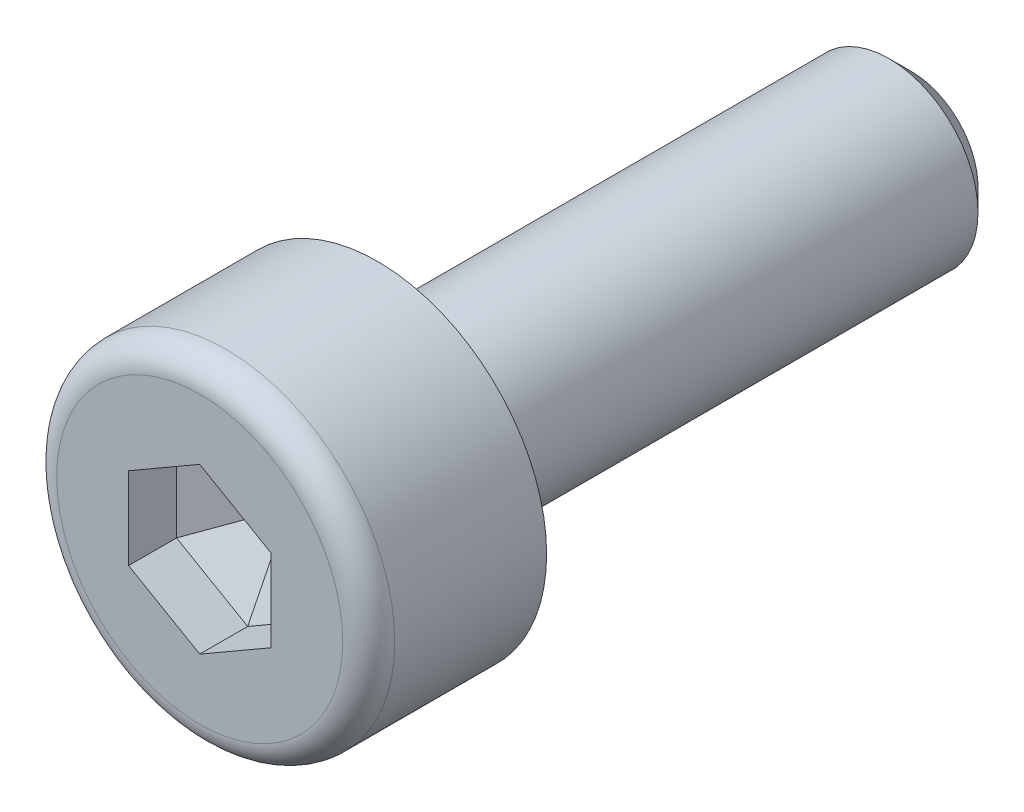
ISO-10303-21;
HEADER;
FILE_DESCRIPTION(('STEP AP214'),'2;1');
FILE_NAME('part.step','',(''),(''),'','','');
FILE_SCHEMA(('AUTOMOTIVE_DESIGN { 1 0 10303 214 1 1 1 1 }'));
ENDSEC;
DATA;
#1=APPLICATION_CONTEXT('core data for automotive mechanical design processes');
#2=APPLICATION_PROTOCOL_DEFINITION('international standard','automotive_design',2000,#1);
#3=PRODUCT_CONTEXT('',#1,'mechanical');
#4=PRODUCT('Part','Part','',(#3));
#5=PRODUCT_RELATED_PRODUCT_CATEGORY('part','',(#4));
#6=PRODUCT_DEFINITION_FORMATION('','',#4);
#7=PRODUCT_DEFINITION_CONTEXT('part definition',#1,'design');
#8=PRODUCT_DEFINITION('design','',#6,#7);
#9=PRODUCT_DEFINITION_SHAPE('','',#8);
#10=(LENGTH_UNIT() NAMED_UNIT(*) SI_UNIT(.MILLI.,.METRE.));
#11=(NAMED_UNIT(*) PLANE_ANGLE_UNIT() SI_UNIT($,.RADIAN.));
#12=(NAMED_UNIT(*) SI_UNIT($,.STERADIAN.) SOLID_ANGLE_UNIT());
#13=UNCERTAINTY_MEASURE_WITH_UNIT(LENGTH_MEASURE(1.E-05),#10,'distance_accuracy_value','');
#14=(GEOMETRIC_REPRESENTATION_CONTEXT(3) GLOBAL_UNCERTAINTY_ASSIGNED_CONTEXT((#13)) GLOBAL_UNIT_ASSIGNED_CONTEXT((#10,
#11,#12)) REPRESENTATION_CONTEXT('',''));
#15=CARTESIAN_POINT('',(0.,0.,0.));
#16=DIRECTION('',(0.,0.,1.));
#17=DIRECTION('',(1.,0.,0.));
#18=AXIS2_PLACEMENT_3D('',#15,#16,#17);
#19=CARTESIAN_POINT('',(0.,0.,0.));
#20=DIRECTION('',(0.,0.,1.));
#21=DIRECTION('',(1.,0.,0.));
#22=AXIS2_PLACEMENT_3D('',#19,#20,#21);
#23=PLANE('',#22);
#24=CARTESIAN_POINT('',(0.,0.,0.));
#25=DIRECTION('',(0.,0.,1.));
#26=DIRECTION('',(1.,0.,0.));
#27=AXIS2_PLACEMENT_3D('',#24,#25,#26);
#28=CIRCLE('',#27,1.1);
#29=CARTESIAN_POINT('',(1.1,0.,0.));
#30=VERTEX_POINT('',#29);
#31=EDGE_CURVE('E11',#30,#30,#28,.T.);
#32=ORIENTED_EDGE('',*,*,#31,.T.);
#33=EDGE_LOOP('',(#32));
#34=FACE_BOUND('',#33,.T.);
#35=CARTESIAN_POINT('',(0.,0.,0.));
#36=DIRECTION('',(0.,0.,1.));
#37=DIRECTION('',(1.,0.,0.));
#38=AXIS2_PLACEMENT_3D('',#35,#36,#37);
#39=CIRCLE('',#38,1.9);
#40=CARTESIAN_POINT('',(1.9,0.,0.));
#41=VERTEX_POINT('',#40);
#42=EDGE_CURVE('E153',#41,#41,#39,.T.);
#43=ORIENTED_EDGE('',*,*,#42,.F.);
#44=EDGE_LOOP('',(#43));
#45=FACE_BOUND('',#44,.T.);
#46=ADVANCED_FACE('F43',(#34,#45),#23,.F.);
#47=CARTESIAN_POINT('',(0.,0.,2.));
#48=DIRECTION('',(0.,0.,-1.));
#49=DIRECTION('',(-1.,0.,0.));
#50=AXIS2_PLACEMENT_3D('',#47,#48,#49);
#51=CYLINDRICAL_SURFACE('',#50,1.9);
#52=CARTESIAN_POINT('',(0.,0.,1.70769230769231));
#53=DIRECTION('',(0.,0.,1.));
#54=DIRECTION('',(1.,0.,0.));
#55=AXIS2_PLACEMENT_3D('',#52,#53,#54);
#56=CIRCLE('',#55,1.9);
#57=CARTESIAN_POINT('',(1.9,0.,1.70769230769231));
#58=VERTEX_POINT('',#57);
#59=EDGE_CURVE('E171',#58,#58,#56,.F.);
#60=ORIENTED_EDGE('',*,*,#59,.T.);
#61=EDGE_LOOP('',(#60));
#62=FACE_BOUND('',#61,.T.);
#63=ORIENTED_EDGE('',*,*,#42,.T.);
#64=EDGE_LOOP('',(#63));
#65=FACE_BOUND('',#64,.T.);
#66=ADVANCED_FACE('F229',(#62,#65),#51,.T.);
#67=CARTESIAN_POINT('',(0.,0.,2.));
#68=DIRECTION('',(0.,0.,1.));
#69=DIRECTION('',(1.,0.,0.));
#70=AXIS2_PLACEMENT_3D('',#67,#68,#69);
#71=PLANE('',#70);
#72=CARTESIAN_POINT('',(0.,0.,2.));
#73=DIRECTION('',(0.,0.,1.));
#74=DIRECTION('',(1.,0.,0.));
#75=AXIS2_PLACEMENT_3D('',#72,#73,#74);
#76=CIRCLE('',#75,1.60769230769231);
#77=CARTESIAN_POINT('',(1.60769230769231,0.,2.));
#78=VERTEX_POINT('',#77);
#79=EDGE_CURVE('E168',#78,#78,#76,.T.);
#80=ORIENTED_EDGE('',*,*,#79,.T.);
#81=EDGE_LOOP('',(#80));
#82=FACE_BOUND('',#81,.T.);
#83=DIRECTION('',(0.,1.,0.));
#84=VECTOR('',#83,1.);
#85=CARTESIAN_POINT('',(0.8,-0.461880215351701,2.));
#86=LINE('',#85,#84);
#87=CARTESIAN_POINT('',(0.8,-0.461880215351701,2.));
#88=VERTEX_POINT('',#87);
#89=CARTESIAN_POINT('',(0.8,0.461880215351701,2.));
#90=VERTEX_POINT('',#89);
#91=EDGE_CURVE('E135',#88,#90,#86,.T.);
#92=ORIENTED_EDGE('',*,*,#91,.F.);
#93=DIRECTION('',(0.866025403784439,0.5,0.));
#94=VECTOR('',#93,1.);
#95=CARTESIAN_POINT('',(0.,-0.923760430703401,2.));
#96=LINE('',#95,#94);
#97=CARTESIAN_POINT('',(0.,-0.923760430703401,2.));
#98=VERTEX_POINT('',#97);
#99=EDGE_CURVE('E148',#98,#88,#96,.T.);
#100=ORIENTED_EDGE('',*,*,#99,.F.);
#101=DIRECTION('',(0.866025403784439,-0.5,0.));
#102=VECTOR('',#101,1.);
#103=CARTESIAN_POINT('',(-0.8,-0.4618802153517,2.));
#104=LINE('',#103,#102);
#105=CARTESIAN_POINT('',(-0.8,-0.4618802153517,2.));
#106=VERTEX_POINT('',#105);
#107=EDGE_CURVE('E142',#106,#98,#104,.T.);
#108=ORIENTED_EDGE('',*,*,#107,.F.);
#109=DIRECTION('',(0.,-1.,0.));
#110=VECTOR('',#109,1.);
#111=CARTESIAN_POINT('',(-0.8,0.461880215351701,2.));
#112=LINE('',#111,#110);
#113=CARTESIAN_POINT('',(-0.8,0.461880215351701,2.));
#114=VERTEX_POINT('',#113);
#115=EDGE_CURVE('E140',#114,#106,#112,.T.);
#116=ORIENTED_EDGE('',*,*,#115,.F.);
#117=DIRECTION('',(-0.866025403784439,-0.5,0.));
#118=VECTOR('',#117,1.);
#119=CARTESIAN_POINT('',(0.,0.923760430703401,2.));
#120=LINE('',#119,#118);
#121=CARTESIAN_POINT('',(0.,0.923760430703401,2.));
#122=VERTEX_POINT('',#121);
#123=EDGE_CURVE('E120',#122,#114,#120,.T.);
#124=ORIENTED_EDGE('',*,*,#123,.F.);
#125=DIRECTION('',(-0.866025403784439,0.5,0.));
#126=VECTOR('',#125,1.);
#127=CARTESIAN_POINT('',(0.8,0.461880215351701,2.));
#128=LINE('',#127,#126);
#129=EDGE_CURVE('E130',#90,#122,#128,.T.);
#130=ORIENTED_EDGE('',*,*,#129,.F.);
#131=EDGE_LOOP('',(#92,#100,#108,#116,#124,#130));
#132=FACE_BOUND('',#131,.T.);
#133=ADVANCED_FACE('F137',(#82,#132),#71,.T.);
#134=CARTESIAN_POINT('',(0.8,-0.461880215351701,1.));
#135=DIRECTION('',(1.,0.,0.));
#136=DIRECTION('',(0.,1.,0.));
#137=AXIS2_PLACEMENT_3D('',#134,#135,#136);
#138=PLANE('',#137);
#139=DIRECTION('',(0.,0.,1.));
#140=VECTOR('',#139,1.);
#141=CARTESIAN_POINT('',(0.8,0.461880215351701,1.));
#142=LINE('',#141,#140);
#143=CARTESIAN_POINT('',(0.8,0.461880215351701,1.46109510086455));
#144=VERTEX_POINT('',#143);
#145=EDGE_CURVE('E127',#144,#90,#142,.T.);
#146=ORIENTED_EDGE('',*,*,#145,.F.);
#147=DIRECTION('',(0.,-1.,0.));
#148=VECTOR('',#147,1.);
#149=CARTESIAN_POINT('',(0.8,-0.461880215351701,1.46109510086455));
#150=LINE('',#149,#148);
#151=CARTESIAN_POINT('',(0.8,-0.461880215351701,1.46109510086455));
#152=VERTEX_POINT('',#151);
#153=EDGE_CURVE('E66',#144,#152,#150,.T.);
#154=ORIENTED_EDGE('',*,*,#153,.T.);
#155=DIRECTION('',(0.,0.,1.));
#156=VECTOR('',#155,1.);
#157=CARTESIAN_POINT('',(0.8,-0.461880215351701,1.));
#158=LINE('',#157,#156);
#159=EDGE_CURVE('E151',#152,#88,#158,.T.);
#160=ORIENTED_EDGE('',*,*,#159,.T.);
#161=ORIENTED_EDGE('',*,*,#91,.T.);
#162=EDGE_LOOP('',(#146,#154,#160,#161));
#163=FACE_BOUND('',#162,.T.);
#164=ADVANCED_FACE('F288',(#163),#138,.F.);
#165=CARTESIAN_POINT('',(0.,-0.923760430703401,1.));
#166=DIRECTION('',(0.5,-0.866025403784439,0.));
#167=DIRECTION('',(0.866025403784439,0.5,0.));
#168=AXIS2_PLACEMENT_3D('',#165,#166,#167);
#169=PLANE('',#168);
#170=ORIENTED_EDGE('',*,*,#159,.F.);
#171=DIRECTION('',(-0.866025403784439,-0.5,0.));
#172=VECTOR('',#171,1.);
#173=CARTESIAN_POINT('',(0.,-0.923760430703401,1.46109510086455));
#174=LINE('',#173,#172);
#175=CARTESIAN_POINT('',(0.,-0.923760430703401,1.46109510086455));
#176=VERTEX_POINT('',#175);
#177=EDGE_CURVE('E58',#152,#176,#174,.T.);
#178=ORIENTED_EDGE('',*,*,#177,.T.);
#179=DIRECTION('',(0.,0.,1.));
#180=VECTOR('',#179,1.);
#181=CARTESIAN_POINT('',(0.,-0.923760430703401,1.));
#182=LINE('',#181,#180);
#183=EDGE_CURVE('E154',#176,#98,#182,.T.);
#184=ORIENTED_EDGE('',*,*,#183,.T.);
#185=ORIENTED_EDGE('',*,*,#99,.T.);
#186=EDGE_LOOP('',(#170,#178,#184,#185));
#187=FACE_BOUND('',#186,.T.);
#188=ADVANCED_FACE('F290',(#187),#169,.F.);
#189=CARTESIAN_POINT('',(-0.8,-0.4618802153517,1.));
#190=DIRECTION('',(-0.5,-0.866025403784439,0.));
#191=DIRECTION('',(0.866025403784439,-0.5,0.));
#192=AXIS2_PLACEMENT_3D('',#189,#190,#191);
#193=PLANE('',#192);
#194=ORIENTED_EDGE('',*,*,#183,.F.);
#195=DIRECTION('',(-0.866025403784439,0.5,0.));
#196=VECTOR('',#195,1.);
#197=CARTESIAN_POINT('',(-0.8,-0.4618802153517,1.46109510086455));
#198=LINE('',#197,#196);
#199=CARTESIAN_POINT('',(-0.8,-0.4618802153517,1.46109510086455));
#200=VERTEX_POINT('',#199);
#201=EDGE_CURVE('E194',#176,#200,#198,.T.);
#202=ORIENTED_EDGE('',*,*,#201,.T.);
#203=DIRECTION('',(0.,0.,1.));
#204=VECTOR('',#203,1.);
#205=CARTESIAN_POINT('',(-0.8,-0.4618802153517,1.));
#206=LINE('',#205,#204);
#207=EDGE_CURVE('E156',#200,#106,#206,.T.);
#208=ORIENTED_EDGE('',*,*,#207,.T.);
#209=ORIENTED_EDGE('',*,*,#107,.T.);
#210=EDGE_LOOP('',(#194,#202,#208,#209));
#211=FACE_BOUND('',#210,.T.);
#212=ADVANCED_FACE('F279',(#211),#193,.F.);
#213=CARTESIAN_POINT('',(-0.8,0.461880215351701,1.));
#214=DIRECTION('',(-1.,0.,0.));
#215=DIRECTION('',(0.,0.,1.));
#216=AXIS2_PLACEMENT_3D('',#213,#214,#215);
#217=PLANE('',#216);
#218=ORIENTED_EDGE('',*,*,#207,.F.);
#219=DIRECTION('',(0.,1.,0.));
#220=VECTOR('',#219,1.);
#221=CARTESIAN_POINT('',(-0.8,0.461880215351701,1.46109510086455));
#222=LINE('',#221,#220);
#223=CARTESIAN_POINT('',(-0.8,0.461880215351701,1.46109510086455));
#224=VERTEX_POINT('',#223);
#225=EDGE_CURVE('E187',#200,#224,#222,.T.);
#226=ORIENTED_EDGE('',*,*,#225,.T.);
#227=DIRECTION('',(0.,0.,1.));
#228=VECTOR('',#227,1.);
#229=CARTESIAN_POINT('',(-0.8,0.461880215351701,1.));
#230=LINE('',#229,#228);
#231=EDGE_CURVE('E126',#224,#114,#230,.T.);
#232=ORIENTED_EDGE('',*,*,#231,.T.);
#233=ORIENTED_EDGE('',*,*,#115,.T.);
#234=EDGE_LOOP('',(#218,#226,#232,#233));
#235=FACE_BOUND('',#234,.T.);
#236=ADVANCED_FACE('F282',(#235),#217,.F.);
#237=CARTESIAN_POINT('',(0.,0.923760430703401,1.));
#238=DIRECTION('',(-0.5,0.866025403784439,0.));
#239=DIRECTION('',(-0.866025403784439,-0.5,0.));
#240=AXIS2_PLACEMENT_3D('',#237,#238,#239);
#241=PLANE('',#240);
#242=ORIENTED_EDGE('',*,*,#231,.F.);
#243=DIRECTION('',(0.866025403784439,0.5,0.));
#244=VECTOR('',#243,1.);
#245=CARTESIAN_POINT('',(0.,0.923760430703401,1.46109510086455));
#246=LINE('',#245,#244);
#247=CARTESIAN_POINT('',(0.,0.923760430703401,1.46109510086455));
#248=VERTEX_POINT('',#247);
#249=EDGE_CURVE('E123',#224,#248,#246,.T.);
#250=ORIENTED_EDGE('',*,*,#249,.T.);
#251=DIRECTION('',(0.,0.,1.));
#252=VECTOR('',#251,1.);
#253=CARTESIAN_POINT('',(0.,0.923760430703401,1.));
#254=LINE('',#253,#252);
#255=EDGE_CURVE('E115',#248,#122,#254,.T.);
#256=ORIENTED_EDGE('',*,*,#255,.T.);
#257=ORIENTED_EDGE('',*,*,#123,.T.);
#258=EDGE_LOOP('',(#242,#250,#256,#257));
#259=FACE_BOUND('',#258,.T.);
#260=ADVANCED_FACE('F118',(#259),#241,.F.);
#261=CARTESIAN_POINT('',(0.8,0.461880215351701,1.));
#262=DIRECTION('',(0.5,0.866025403784439,0.));
#263=DIRECTION('',(-0.866025403784439,0.5,0.));
#264=AXIS2_PLACEMENT_3D('',#261,#262,#263);
#265=PLANE('',#264);
#266=ORIENTED_EDGE('',*,*,#255,.F.);
#267=DIRECTION('',(0.866025403784439,-0.5,0.));
#268=VECTOR('',#267,1.);
#269=CARTESIAN_POINT('',(0.8,0.461880215351701,1.46109510086455));
#270=LINE('',#269,#268);
#271=EDGE_CURVE('E191',#248,#144,#270,.T.);
#272=ORIENTED_EDGE('',*,*,#271,.T.);
#273=ORIENTED_EDGE('',*,*,#145,.T.);
#274=ORIENTED_EDGE('',*,*,#129,.T.);
#275=EDGE_LOOP('',(#266,#272,#273,#274));
#276=FACE_BOUND('',#275,.T.);
#277=ADVANCED_FACE('F131',(#276),#265,.F.);
#278=CARTESIAN_POINT('',(0.,0.,1.));
#279=DIRECTION('',(0.,0.,1.));
#280=DIRECTION('',(1.,0.,0.));
#281=AXIS2_PLACEMENT_3D('',#278,#279,#280);
#282=PLANE('',#281);
#283=DIRECTION('',(-0.866025403784439,-0.5,0.));
#284=VECTOR('',#283,1.);
#285=CARTESIAN_POINT('',(-0.000679929090745742,0.00117767173071574,1.));
#286=LINE('',#285,#284);
#287=CARTESIAN_POINT('',(0.,0.00157022897428735,1.));
#288=VERTEX_POINT('',#287);
#289=CARTESIAN_POINT('',(-0.0013598581814912,0.000785114487144004,1.));
#290=VERTEX_POINT('',#289);
#291=EDGE_CURVE('E182',#288,#290,#286,.T.);
#292=ORIENTED_EDGE('',*,*,#291,.T.);
#293=DIRECTION('',(0.,-1.,0.));
#294=VECTOR('',#293,1.);
#295=CARTESIAN_POINT('',(-0.00135985818149119,0.,1.));
#296=LINE('',#295,#294);
#297=CARTESIAN_POINT('',(-0.00135985818149119,-0.000785114487143163,1.));
#298=VERTEX_POINT('',#297);
#299=EDGE_CURVE('E184',#290,#298,#296,.T.);
#300=ORIENTED_EDGE('',*,*,#299,.T.);
#301=DIRECTION('',(0.866025403784439,-0.5,0.));
#302=VECTOR('',#301,1.);
#303=CARTESIAN_POINT('',(-0.000679929090745377,-0.0011776717307151,1.));
#304=LINE('',#303,#302);
#305=CARTESIAN_POINT('',(0.,-0.00157022897428734,1.));
#306=VERTEX_POINT('',#305);
#307=EDGE_CURVE('E176',#298,#306,#304,.T.);
#308=ORIENTED_EDGE('',*,*,#307,.T.);
#309=DIRECTION('',(0.866025403784439,0.5,0.));
#310=VECTOR('',#309,1.);
#311=CARTESIAN_POINT('',(0.000679929090745837,-0.0011776717307159,1.));
#312=LINE('',#311,#310);
#313=CARTESIAN_POINT('',(0.00135985818149136,-0.000785114487144135,1.));
#314=VERTEX_POINT('',#313);
#315=EDGE_CURVE('E174',#306,#314,#312,.T.);
#316=ORIENTED_EDGE('',*,*,#315,.T.);
#317=DIRECTION('',(0.,1.,0.));
#318=VECTOR('',#317,1.);
#319=CARTESIAN_POINT('',(0.00135985818149135,0.,1.));
#320=LINE('',#319,#318);
#321=CARTESIAN_POINT('',(0.00135985818149135,0.00078511448714334,1.));
#322=VERTEX_POINT('',#321);
#323=EDGE_CURVE('E178',#314,#322,#320,.T.);
#324=ORIENTED_EDGE('',*,*,#323,.T.);
#325=DIRECTION('',(-0.866025403784439,0.5,0.));
#326=VECTOR('',#325,1.);
#327=CARTESIAN_POINT('',(0.000679929090745498,0.00117767173071531,1.));
#328=LINE('',#327,#326);
#329=EDGE_CURVE('E180',#322,#288,#328,.T.);
#330=ORIENTED_EDGE('',*,*,#329,.T.);
#331=EDGE_LOOP('',(#292,#300,#308,#316,#324,#330));
#332=FACE_BOUND('',#331,.T.);
#333=ADVANCED_FACE('F299',(#332),#282,.T.);
#334=CARTESIAN_POINT('',(0.,0.,-6.));
#335=DIRECTION('',(0.,0.,1.));
#336=DIRECTION('',(1.,0.,0.));
#337=AXIS2_PLACEMENT_3D('',#334,#335,#336);
#338=CYLINDRICAL_SURFACE('',#337,1.);
#339=CARTESIAN_POINT('',(0.,0.,-0.1));
#340=DIRECTION('',(0.,0.,1.));
#341=DIRECTION('',(1.,0.,0.));
#342=AXIS2_PLACEMENT_3D('',#339,#340,#341);
#343=CIRCLE('',#342,1.);
#344=CARTESIAN_POINT('',(1.,0.,-0.1));
#345=VERTEX_POINT('',#344);
#346=EDGE_CURVE('E51',#345,#345,#343,.F.);
#347=ORIENTED_EDGE('',*,*,#346,.T.);
#348=EDGE_LOOP('',(#347));
#349=FACE_BOUND('',#348,.T.);
#350=CARTESIAN_POINT('',(0.,0.,-5.75));
#351=DIRECTION('',(0.,0.,-1.));
#352=DIRECTION('',(-1.,0.,0.));
#353=AXIS2_PLACEMENT_3D('',#350,#351,#352);
#354=CIRCLE('',#353,1.);
#355=CARTESIAN_POINT('',(-1.,0.,-5.75));
#356=VERTEX_POINT('',#355);
#357=EDGE_CURVE('E165',#356,#356,#354,.F.);
#358=ORIENTED_EDGE('',*,*,#357,.T.);
#359=EDGE_LOOP('',(#358));
#360=FACE_BOUND('',#359,.T.);
#361=ADVANCED_FACE('F215',(#349,#360),#338,.T.);
#362=CARTESIAN_POINT('',(0.,0.,-6.));
#363=DIRECTION('',(0.,0.,-1.));
#364=DIRECTION('',(-1.,0.,0.));
#365=AXIS2_PLACEMENT_3D('',#362,#363,#364);
#366=PLANE('',#365);
#367=CARTESIAN_POINT('',(0.,0.,-6.));
#368=DIRECTION('',(0.,0.,-1.));
#369=DIRECTION('',(-1.,0.,0.));
#370=AXIS2_PLACEMENT_3D('',#367,#368,#369);
#371=CIRCLE('',#370,0.750000000000001);
#372=CARTESIAN_POINT('',(-0.750000000000001,0.,-6.));
#373=VERTEX_POINT('',#372);
#374=EDGE_CURVE('E162',#373,#373,#371,.T.);
#375=ORIENTED_EDGE('',*,*,#374,.T.);
#376=EDGE_LOOP('',(#375));
#377=FACE_BOUND('',#376,.T.);
#378=ADVANCED_FACE('F245',(#377),#366,.T.);
#379=CARTESIAN_POINT('',(0.,0.,-6.));
#380=DIRECTION('',(0.,0.,1.));
#381=DIRECTION('',(1.,0.,0.));
#382=AXIS2_PLACEMENT_3D('',#379,#380,#381);
#383=CONICAL_SURFACE('',#382,0.750000000000001,0.785398163397445);
#384=ORIENTED_EDGE('',*,*,#357,.F.);
#385=EDGE_LOOP('',(#384));
#386=FACE_BOUND('',#385,.T.);
#387=ORIENTED_EDGE('',*,*,#374,.F.);
#388=EDGE_LOOP('',(#387));
#389=FACE_BOUND('',#388,.T.);
#390=ADVANCED_FACE('F241',(#386,#389),#383,.T.);
#391=CARTESIAN_POINT('',(0.,0.,1.70769230769231));
#392=DIRECTION('',(0.,0.,1.));
#393=DIRECTION('',(1.,0.,0.));
#394=AXIS2_PLACEMENT_3D('',#391,#392,#393);
#395=TOROIDAL_SURFACE('',#394,1.60769230769231,0.292307692307692);
#396=ORIENTED_EDGE('',*,*,#59,.F.);
#397=EDGE_LOOP('',(#396));
#398=FACE_BOUND('',#397,.T.);
#399=ORIENTED_EDGE('',*,*,#79,.F.);
#400=EDGE_LOOP('',(#399));
#401=FACE_BOUND('',#400,.T.);
#402=ADVANCED_FACE('F244',(#398,#401),#395,.T.);
#403=CARTESIAN_POINT('',(0.00135985818149135,0.,1.));
#404=DIRECTION('',(0.499999999999995,0.,-0.866025403784441));
#405=DIRECTION('',(0.,1.,0.));
#406=AXIS2_PLACEMENT_3D('',#403,#404,#405);
#407=PLANE('',#406);
#408=DIRECTION('',(-0.774596669241485,0.447213595499959,-0.447213595499953));
#409=VECTOR('',#408,1.);
#410=CARTESIAN_POINT('',(0.00108788654519294,-0.000628091589715321,0.999842977102571));
#411=LINE('',#410,#409);
#412=EDGE_CURVE('E207',#152,#314,#411,.T.);
#413=ORIENTED_EDGE('',*,*,#412,.F.);
#414=ORIENTED_EDGE('',*,*,#153,.F.);
#415=DIRECTION('',(-0.774596669241485,-0.44721359549996,-0.447213595499953));
#416=VECTOR('',#415,1.);
#417=CARTESIAN_POINT('',(0.00108788654519301,0.000628091589714548,0.999842977102571));
#418=LINE('',#417,#416);
#419=EDGE_CURVE('E210',#322,#144,#418,.F.);
#420=ORIENTED_EDGE('',*,*,#419,.F.);
#421=ORIENTED_EDGE('',*,*,#323,.F.);
#422=EDGE_LOOP('',(#413,#414,#420,#421));
#423=FACE_BOUND('',#422,.T.);
#424=ADVANCED_FACE('F248',(#423),#407,.F.);
#425=CARTESIAN_POINT('',(0.000679929090745498,0.00117767173071531,1.));
#426=DIRECTION('',(0.249999999999997,0.433012701892215,-0.866025403784441));
#427=DIRECTION('',(-0.866025403784439,0.5,0.));
#428=AXIS2_PLACEMENT_3D('',#425,#426,#427);
#429=PLANE('',#428);
#430=ORIENTED_EDGE('',*,*,#419,.T.);
#431=ORIENTED_EDGE('',*,*,#271,.F.);
#432=DIRECTION('',(0.,-0.894427190999918,-0.447213595499953));
#433=VECTOR('',#432,1.);
#434=CARTESIAN_POINT('',(0.,0.00125618317943004,0.999842977102571));
#435=LINE('',#434,#433);
#436=EDGE_CURVE('E204',#288,#248,#435,.F.);
#437=ORIENTED_EDGE('',*,*,#436,.F.);
#438=ORIENTED_EDGE('',*,*,#329,.F.);
#439=EDGE_LOOP('',(#430,#431,#437,#438));
#440=FACE_BOUND('',#439,.T.);
#441=ADVANCED_FACE('F261',(#440),#429,.F.);
#442=CARTESIAN_POINT('',(0.000679929090745851,-0.00117767173071592,1.));
#443=DIRECTION('',(0.249999999999998,-0.433012701892215,-0.866025403784441));
#444=DIRECTION('',(0.866025403784439,0.5,0.));
#445=AXIS2_PLACEMENT_3D('',#442,#443,#444);
#446=PLANE('',#445);
#447=ORIENTED_EDGE('',*,*,#412,.T.);
#448=ORIENTED_EDGE('',*,*,#315,.F.);
#449=DIRECTION('',(0.,-0.894427190999918,0.447213595499953));
#450=VECTOR('',#449,1.);
#451=CARTESIAN_POINT('',(0.,-0.00125618317942957,0.999842977102571));
#452=LINE('',#451,#450);
#453=EDGE_CURVE('E201',#176,#306,#452,.F.);
#454=ORIENTED_EDGE('',*,*,#453,.F.);
#455=ORIENTED_EDGE('',*,*,#177,.F.);
#456=EDGE_LOOP('',(#447,#448,#454,#455));
#457=FACE_BOUND('',#456,.T.);
#458=ADVANCED_FACE('F257',(#457),#446,.F.);
#459=CARTESIAN_POINT('',(-0.000679929090745729,0.00117767173071571,1.));
#460=DIRECTION('',(-0.249999999999997,0.433012701892215,-0.866025403784441));
#461=DIRECTION('',(-0.866025403784439,-0.5,0.));
#462=AXIS2_PLACEMENT_3D('',#459,#460,#461);
#463=PLANE('',#462);
#464=ORIENTED_EDGE('',*,*,#436,.T.);
#465=ORIENTED_EDGE('',*,*,#249,.F.);
#466=DIRECTION('',(0.774596669241485,-0.447213595499959,-0.447213595499953));
#467=VECTOR('',#466,1.);
#468=CARTESIAN_POINT('',(-0.00108788654519284,0.000628091589715171,0.999842977102571));
#469=LINE('',#468,#467);
#470=EDGE_CURVE('E199',#290,#224,#469,.F.);
#471=ORIENTED_EDGE('',*,*,#470,.F.);
#472=ORIENTED_EDGE('',*,*,#291,.F.);
#473=EDGE_LOOP('',(#464,#465,#471,#472));
#474=FACE_BOUND('',#473,.T.);
#475=ADVANCED_FACE('F253',(#474),#463,.F.);
#476=CARTESIAN_POINT('',(-0.00067992909074539,-0.00117767173071513,1.));
#477=DIRECTION('',(-0.249999999999998,-0.433012701892215,-0.866025403784441));
#478=DIRECTION('',(0.866025403784439,-0.5,0.));
#479=AXIS2_PLACEMENT_3D('',#476,#477,#478);
#480=PLANE('',#479);
#481=ORIENTED_EDGE('',*,*,#453,.T.);
#482=ORIENTED_EDGE('',*,*,#307,.F.);
#483=DIRECTION('',(-0.774596669241485,-0.447213595499959,0.447213595499953));
#484=VECTOR('',#483,1.);
#485=CARTESIAN_POINT('',(-0.00108788654519311,-0.000628091589714545,0.999842977102571));
#486=LINE('',#485,#484);
#487=EDGE_CURVE('E197',#200,#298,#486,.F.);
#488=ORIENTED_EDGE('',*,*,#487,.F.);
#489=ORIENTED_EDGE('',*,*,#201,.F.);
#490=EDGE_LOOP('',(#481,#482,#488,#489));
#491=FACE_BOUND('',#490,.T.);
#492=ADVANCED_FACE('F224',(#491),#480,.F.);
#493=CARTESIAN_POINT('',(-0.00135985818149119,0.,1.));
#494=DIRECTION('',(-0.499999999999995,0.,-0.866025403784441));
#495=DIRECTION('',(0.,-1.,0.));
#496=AXIS2_PLACEMENT_3D('',#493,#494,#495);
#497=PLANE('',#496);
#498=ORIENTED_EDGE('',*,*,#470,.T.);
#499=ORIENTED_EDGE('',*,*,#225,.F.);
#500=ORIENTED_EDGE('',*,*,#487,.T.);
#501=ORIENTED_EDGE('',*,*,#299,.F.);
#502=EDGE_LOOP('',(#498,#499,#500,#501));
#503=FACE_BOUND('',#502,.T.);
#504=ADVANCED_FACE('F219',(#503),#497,.F.);
#505=CARTESIAN_POINT('',(0.,0.,-0.1));
#506=DIRECTION('',(0.,0.,1.));
#507=DIRECTION('',(1.,0.,0.));
#508=AXIS2_PLACEMENT_3D('',#505,#506,#507);
#509=TOROIDAL_SURFACE('',#508,1.1,0.1);
#510=ORIENTED_EDGE('',*,*,#31,.F.);
#511=EDGE_LOOP('',(#510));
#512=FACE_BOUND('',#511,.T.);
#513=ORIENTED_EDGE('',*,*,#346,.F.);
#514=EDGE_LOOP('',(#513));
#515=FACE_BOUND('',#514,.T.);
#516=ADVANCED_FACE('F45',(#512,#515),#509,.F.);
#517=CLOSED_SHELL('',(#46,#66,#133,#164,#188,#212,#236,#260,#277,#333,#361,#378,#390,#402,#424,
#441,#458,#475,#492,#504,#516));
#518=MANIFOLD_SOLID_BREP('B2',#517);
#519=ADVANCED_BREP_SHAPE_REPRESENTATION('',(#18,#518),#14);
#520=SHAPE_DEFINITION_REPRESENTATION(#9,#519);
ENDSEC;
END-ISO-10303-21;
